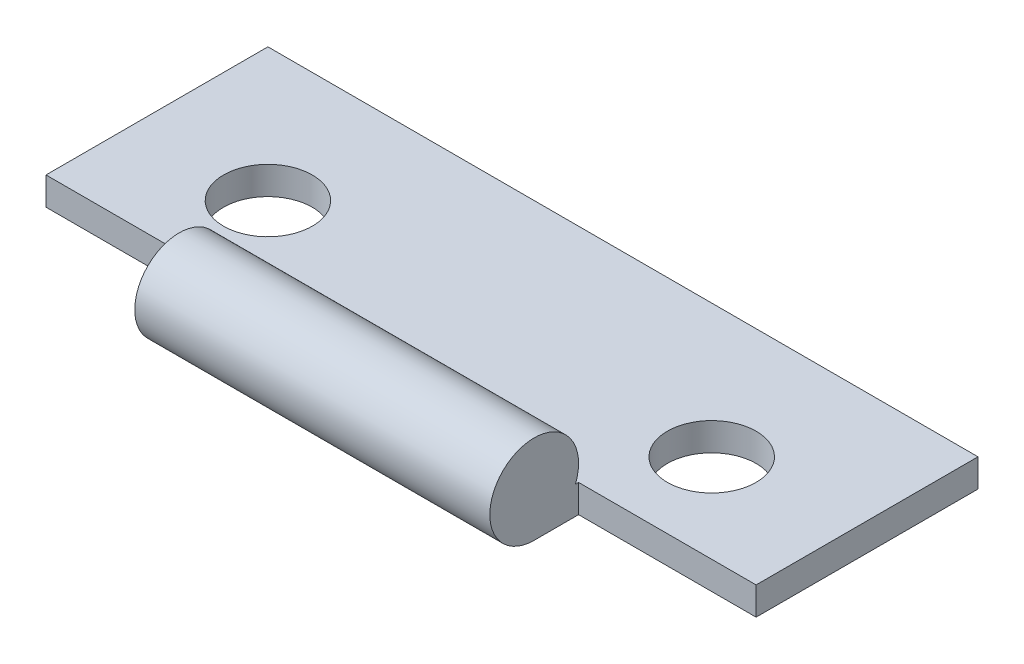
ISO-10303-21;
HEADER;
FILE_DESCRIPTION(('STEP AP214'),'2;1');
FILE_NAME('part.step','',(''),(''),'','','');
FILE_SCHEMA(('AUTOMOTIVE_DESIGN { 1 0 10303 214 1 1 1 1 }'));
ENDSEC;
DATA;
#1=APPLICATION_CONTEXT('core data for automotive mechanical design processes');
#2=APPLICATION_PROTOCOL_DEFINITION('international standard','automotive_design',2000,#1);
#3=PRODUCT_CONTEXT('',#1,'mechanical');
#4=PRODUCT('Part','Part','',(#3));
#5=PRODUCT_RELATED_PRODUCT_CATEGORY('part','',(#4));
#6=PRODUCT_DEFINITION_FORMATION('','',#4);
#7=PRODUCT_DEFINITION_CONTEXT('part definition',#1,'design');
#8=PRODUCT_DEFINITION('design','',#6,#7);
#9=PRODUCT_DEFINITION_SHAPE('','',#8);
#10=(LENGTH_UNIT() NAMED_UNIT(*) SI_UNIT(.MILLI.,.METRE.));
#11=(NAMED_UNIT(*) PLANE_ANGLE_UNIT() SI_UNIT($,.RADIAN.));
#12=(NAMED_UNIT(*) SI_UNIT($,.STERADIAN.) SOLID_ANGLE_UNIT());
#13=UNCERTAINTY_MEASURE_WITH_UNIT(LENGTH_MEASURE(1.E-05),#10,'distance_accuracy_value','');
#14=(GEOMETRIC_REPRESENTATION_CONTEXT(3) GLOBAL_UNCERTAINTY_ASSIGNED_CONTEXT((#13)) GLOBAL_UNIT_ASSIGNED_CONTEXT((#10,
#11,#12)) REPRESENTATION_CONTEXT('',''));
#15=CARTESIAN_POINT('',(0.,0.,0.));
#16=DIRECTION('',(0.,0.,1.));
#17=DIRECTION('',(1.,0.,0.));
#18=AXIS2_PLACEMENT_3D('',#15,#16,#17);
#19=CARTESIAN_POINT('',(-1.19904086659517E-11,1.00000000000033,0.));
#20=DIRECTION('',(0.,1.00000000000007,0.));
#21=DIRECTION('',(0.,0.,1.00000000000007));
#22=AXIS2_PLACEMENT_3D('',#19,#20,#21);
#23=PLANE('',#22);
#24=DIRECTION('',(-1.,0.,0.));
#25=VECTOR('',#24,1.);
#26=CARTESIAN_POINT('',(19.049999999988,1.00000000000033,-1.4747881203814));
#27=LINE('',#26,#25);
#28=CARTESIAN_POINT('',(19.049999999988,1.00000000000033,-1.4747881203814));
#29=VERTEX_POINT('',#28);
#30=CARTESIAN_POINT('',(6.34999999998809,1.00000000000033,-1.4747881203776));
#31=VERTEX_POINT('',#30);
#32=EDGE_CURVE('E53',#29,#31,#27,.T.);
#33=ORIENTED_EDGE('',*,*,#32,.F.);
#34=DIRECTION('',(0.,0.,-1.00000000000007));
#35=VECTOR('',#34,1.);
#36=CARTESIAN_POINT('',(19.049999999988,1.00000000000033,-1.5875000000061));
#37=LINE('',#36,#35);
#38=CARTESIAN_POINT('',(19.049999999988,1.00000000000033,-1.5875000000061));
#39=VERTEX_POINT('',#38);
#40=EDGE_CURVE('E136',#29,#39,#37,.T.);
#41=ORIENTED_EDGE('',*,*,#40,.T.);
#42=DIRECTION('',(1.,0.,0.));
#43=VECTOR('',#42,1.);
#44=CARTESIAN_POINT('',(25.3999999999881,1.00000000000022,-1.58750000000596));
#45=LINE('',#44,#43);
#46=CARTESIAN_POINT('',(25.3999999999881,1.00000000000022,-1.58750000000596));
#47=VERTEX_POINT('',#46);
#48=EDGE_CURVE('E139',#39,#47,#45,.T.);
#49=ORIENTED_EDGE('',*,*,#48,.T.);
#50=DIRECTION('',(0.,0.,-1.00000000000007));
#51=VECTOR('',#50,1.);
#52=CARTESIAN_POINT('',(25.3999999999881,1.00000000000022,-9.52500000000644));
#53=LINE('',#52,#51);
#54=CARTESIAN_POINT('',(25.3999999999881,1.00000000000022,-9.52500000000644));
#55=VERTEX_POINT('',#54);
#56=EDGE_CURVE('E141',#47,#55,#53,.T.);
#57=ORIENTED_EDGE('',*,*,#56,.T.);
#58=DIRECTION('',(-1.,0.,0.));
#59=VECTOR('',#58,1.);
#60=CARTESIAN_POINT('',(-1.19765308781439E-11,1.00000000000033,-9.52500000000001));
#61=LINE('',#60,#59);
#62=CARTESIAN_POINT('',(-1.19765308781439E-11,1.00000000000033,-9.52500000000001));
#63=VERTEX_POINT('',#62);
#64=EDGE_CURVE('E143',#55,#63,#61,.T.);
#65=ORIENTED_EDGE('',*,*,#64,.T.);
#66=DIRECTION('',(0.,0.,1.00000000000007));
#67=VECTOR('',#66,1.);
#68=CARTESIAN_POINT('',(-1.19765308781439E-11,1.00000000000033,-9.52500000000001));
#69=LINE('',#68,#67);
#70=CARTESIAN_POINT('',(-1.19904086659517E-11,1.00000000000033,-1.58749999999996));
#71=VERTEX_POINT('',#70);
#72=EDGE_CURVE('E145',#63,#71,#69,.T.);
#73=ORIENTED_EDGE('',*,*,#72,.T.);
#74=DIRECTION('',(1.,0.,0.));
#75=VECTOR('',#74,1.);
#76=CARTESIAN_POINT('',(-1.19904086659517E-11,1.00000000000033,-1.58749999999996));
#77=LINE('',#76,#75);
#78=CARTESIAN_POINT('',(6.34999999998809,1.00000000000033,-1.5875000000023));
#79=VERTEX_POINT('',#78);
#80=EDGE_CURVE('E147',#71,#79,#77,.T.);
#81=ORIENTED_EDGE('',*,*,#80,.T.);
#82=DIRECTION('',(0.,0.,1.00000000000007));
#83=VECTOR('',#82,1.);
#84=CARTESIAN_POINT('',(6.34999999998809,1.00000000000033,-1.5875000000023));
#85=LINE('',#84,#83);
#86=EDGE_CURVE('E49',#79,#31,#85,.T.);
#87=ORIENTED_EDGE('',*,*,#86,.T.);
#88=EDGE_LOOP('',(#33,#41,#49,#57,#65,#73,#81,#87));
#89=FACE_BOUND('',#88,.T.);
#90=CARTESIAN_POINT('',(4.76249999998801,1.00000000000033,-4.76250000000192));
#91=DIRECTION('',(0.,1.00000000000007,0.));
#92=DIRECTION('',(0.,0.,1.00000000000007));
#93=AXIS2_PLACEMENT_3D('',#90,#91,#92);
#94=CIRCLE('',#93,1.5875);
#95=CARTESIAN_POINT('',(4.76249999998801,1.00000000000033,-3.1750000000018));
#96=VERTEX_POINT('',#95);
#97=EDGE_CURVE('E107',#96,#96,#94,.T.);
#98=ORIENTED_EDGE('',*,*,#97,.F.);
#99=EDGE_LOOP('',(#98));
#100=FACE_BOUND('',#99,.T.);
#101=CARTESIAN_POINT('',(20.6374999999881,1.00000000000033,-4.76250000000655));
#102=DIRECTION('',(0.,1.00000000000007,0.));
#103=DIRECTION('',(0.,0.,-1.00000000000007));
#104=AXIS2_PLACEMENT_3D('',#101,#102,#103);
#105=CIRCLE('',#104,1.5875);
#106=CARTESIAN_POINT('',(20.6374999999881,1.00000000000033,-6.35000000000667));
#107=VERTEX_POINT('',#106);
#108=EDGE_CURVE('E125',#107,#107,#105,.T.);
#109=ORIENTED_EDGE('',*,*,#108,.F.);
#110=EDGE_LOOP('',(#109));
#111=FACE_BOUND('',#110,.T.);
#112=ADVANCED_FACE('F34',(#89,#100,#111),#23,.T.);
#113=CARTESIAN_POINT('',(0.,0.,0.));
#114=DIRECTION('',(0.,1.00000000000007,0.));
#115=DIRECTION('',(0.,0.,1.00000000000007));
#116=AXIS2_PLACEMENT_3D('',#113,#114,#115);
#117=PLANE('',#116);
#118=DIRECTION('',(0.,0.,1.00000000000007));
#119=VECTOR('',#118,1.);
#120=CARTESIAN_POINT('',(6.35000000000008,0.,-1.5875000000023));
#121=LINE('',#120,#119);
#122=CARTESIAN_POINT('',(6.35000000000008,0.,-1.5875000000023));
#123=VERTEX_POINT('',#122);
#124=CARTESIAN_POINT('',(6.35000000000008,0.,-2.33146835171283E-12));
#125=VERTEX_POINT('',#124);
#126=EDGE_CURVE('E98',#123,#125,#121,.T.);
#127=ORIENTED_EDGE('',*,*,#126,.F.);
#128=DIRECTION('',(1.,0.,0.));
#129=VECTOR('',#128,1.);
#130=CARTESIAN_POINT('',(0.,0.,-1.58749999999996));
#131=LINE('',#130,#129);
#132=CARTESIAN_POINT('',(0.,0.,-1.58749999999996));
#133=VERTEX_POINT('',#132);
#134=EDGE_CURVE('E137',#133,#123,#131,.T.);
#135=ORIENTED_EDGE('',*,*,#134,.F.);
#136=DIRECTION('',(0.,0.,1.00000000000007));
#137=VECTOR('',#136,1.);
#138=CARTESIAN_POINT('',(-1.19765308781439E-11,0.,-9.52500000000001));
#139=LINE('',#138,#137);
#140=CARTESIAN_POINT('',(-1.19765308781439E-11,0.,-9.52500000000001));
#141=VERTEX_POINT('',#140);
#142=EDGE_CURVE('E156',#141,#133,#139,.T.);
#143=ORIENTED_EDGE('',*,*,#142,.F.);
#144=DIRECTION('',(-1.,0.,0.));
#145=VECTOR('',#144,1.);
#146=CARTESIAN_POINT('',(-1.19765308781439E-11,0.,-9.52500000000001));
#147=LINE('',#146,#145);
#148=CARTESIAN_POINT('',(25.3999999999881,-1.11022302462516E-13,-9.52500000000644));
#149=VERTEX_POINT('',#148);
#150=EDGE_CURVE('E154',#149,#141,#147,.T.);
#151=ORIENTED_EDGE('',*,*,#150,.F.);
#152=DIRECTION('',(0.,0.,-1.00000000000007));
#153=VECTOR('',#152,1.);
#154=CARTESIAN_POINT('',(25.3999999999881,-1.11022302462516E-13,-9.52500000000644));
#155=LINE('',#154,#153);
#156=CARTESIAN_POINT('',(25.4000000000001,-1.11022302462516E-13,-1.58750000000596));
#157=VERTEX_POINT('',#156);
#158=EDGE_CURVE('E152',#157,#149,#155,.T.);
#159=ORIENTED_EDGE('',*,*,#158,.F.);
#160=DIRECTION('',(1.,0.,0.));
#161=VECTOR('',#160,1.);
#162=CARTESIAN_POINT('',(25.4000000000001,-1.11022302462516E-13,-1.58750000000596));
#163=LINE('',#162,#161);
#164=CARTESIAN_POINT('',(19.05,0.,-1.5875000000061));
#165=VERTEX_POINT('',#164);
#166=EDGE_CURVE('E150',#165,#157,#163,.T.);
#167=ORIENTED_EDGE('',*,*,#166,.F.);
#168=DIRECTION('',(0.,0.,-1.00000000000007));
#169=VECTOR('',#168,1.);
#170=CARTESIAN_POINT('',(19.05,0.,-1.5875000000061));
#171=LINE('',#170,#169);
#172=CARTESIAN_POINT('',(19.05,0.,-6.13398221105399E-12));
#173=VERTEX_POINT('',#172);
#174=EDGE_CURVE('E113',#173,#165,#171,.T.);
#175=ORIENTED_EDGE('',*,*,#174,.F.);
#176=DIRECTION('',(1.,0.,0.));
#177=VECTOR('',#176,1.);
#178=CARTESIAN_POINT('',(6.35000000000008,0.,-2.33146835171283E-12));
#179=LINE('',#178,#177);
#180=EDGE_CURVE('E106',#125,#173,#179,.T.);
#181=ORIENTED_EDGE('',*,*,#180,.F.);
#182=EDGE_LOOP('',(#127,#135,#143,#151,#159,#167,#175,#181));
#183=FACE_BOUND('',#182,.T.);
#184=CARTESIAN_POINT('',(4.7625,0.,-4.76250000000192));
#185=DIRECTION('',(0.,1.00000000000007,0.));
#186=DIRECTION('',(0.,0.,1.00000000000007));
#187=AXIS2_PLACEMENT_3D('',#184,#185,#186);
#188=CIRCLE('',#187,1.5875);
#189=CARTESIAN_POINT('',(4.7625,0.,-3.1750000000018));
#190=VERTEX_POINT('',#189);
#191=EDGE_CURVE('E128',#190,#190,#188,.T.);
#192=ORIENTED_EDGE('',*,*,#191,.T.);
#193=EDGE_LOOP('',(#192));
#194=FACE_BOUND('',#193,.T.);
#195=CARTESIAN_POINT('',(20.6375000000001,0.,-4.76250000000655));
#196=DIRECTION('',(0.,1.00000000000007,0.));
#197=DIRECTION('',(0.,0.,-1.00000000000007));
#198=AXIS2_PLACEMENT_3D('',#195,#196,#197);
#199=CIRCLE('',#198,1.5875);
#200=CARTESIAN_POINT('',(20.6375000000001,0.,-6.35000000000667));
#201=VERTEX_POINT('',#200);
#202=EDGE_CURVE('E124',#201,#201,#199,.T.);
#203=ORIENTED_EDGE('',*,*,#202,.T.);
#204=EDGE_LOOP('',(#203));
#205=FACE_BOUND('',#204,.T.);
#206=ADVANCED_FACE('F110',(#183,#194,#205),#117,.F.);
#207=CARTESIAN_POINT('',(6.34999999998809,1.00000000000033,-1.5875000000023));
#208=DIRECTION('',(1.,0.,0.));
#209=DIRECTION('',(0.,0.,-1.00000000000007));
#210=AXIS2_PLACEMENT_3D('',#207,#208,#209);
#211=PLANE('',#210);
#212=ORIENTED_EDGE('',*,*,#126,.T.);
#213=CARTESIAN_POINT('',(6.34999999998809,1.5875000000003,-2.33146835171283E-12));
#214=DIRECTION('',(-1.,0.,0.));
#215=DIRECTION('',(0.,0.,1.00000000000007));
#216=AXIS2_PLACEMENT_3D('',#213,#214,#215);
#217=CIRCLE('',#216,1.5875);
#218=EDGE_CURVE('E101',#125,#31,#217,.T.);
#219=ORIENTED_EDGE('',*,*,#218,.T.);
#220=ORIENTED_EDGE('',*,*,#86,.F.);
#221=DIRECTION('',(0.,-1.00000000000007,0.));
#222=VECTOR('',#221,1.);
#223=CARTESIAN_POINT('',(6.34999999998809,1.00000000000033,-1.5875000000023));
#224=LINE('',#223,#222);
#225=EDGE_CURVE('E103',#79,#123,#224,.T.);
#226=ORIENTED_EDGE('',*,*,#225,.T.);
#227=EDGE_LOOP('',(#212,#219,#220,#226));
#228=FACE_BOUND('',#227,.T.);
#229=ADVANCED_FACE('F36',(#228),#211,.F.);
#230=CARTESIAN_POINT('',(19.049999999988,1.00000000000033,-1.5875000000061));
#231=DIRECTION('',(-1.,0.,0.));
#232=DIRECTION('',(0.,0.,1.00000000000007));
#233=AXIS2_PLACEMENT_3D('',#230,#231,#232);
#234=PLANE('',#233);
#235=ORIENTED_EDGE('',*,*,#40,.F.);
#236=CARTESIAN_POINT('',(19.049999999988,1.5875000000003,-6.13398221105399E-12));
#237=DIRECTION('',(-1.,0.,0.));
#238=DIRECTION('',(0.,0.,1.00000000000007));
#239=AXIS2_PLACEMENT_3D('',#236,#237,#238);
#240=CIRCLE('',#239,1.5875);
#241=EDGE_CURVE('E119',#173,#29,#240,.T.);
#242=ORIENTED_EDGE('',*,*,#241,.F.);
#243=ORIENTED_EDGE('',*,*,#174,.T.);
#244=DIRECTION('',(0.,-1.00000000000007,0.));
#245=VECTOR('',#244,1.);
#246=CARTESIAN_POINT('',(19.049999999988,1.00000000000033,-1.5875000000061));
#247=LINE('',#246,#245);
#248=EDGE_CURVE('E11',#39,#165,#247,.T.);
#249=ORIENTED_EDGE('',*,*,#248,.F.);
#250=EDGE_LOOP('',(#235,#242,#243,#249));
#251=FACE_BOUND('',#250,.T.);
#252=ADVANCED_FACE('F192',(#251),#234,.F.);
#253=CARTESIAN_POINT('',(25.3999999999881,1.00000000000022,-1.58750000000596));
#254=DIRECTION('',(0.,0.,-1.00000000000007));
#255=DIRECTION('',(-1.,0.,0.));
#256=AXIS2_PLACEMENT_3D('',#253,#254,#255);
#257=PLANE('',#256);
#258=ORIENTED_EDGE('',*,*,#166,.T.);
#259=DIRECTION('',(0.,-1.00000000000007,0.));
#260=VECTOR('',#259,1.);
#261=CARTESIAN_POINT('',(25.3999999999881,1.00000000000022,-1.58750000000596));
#262=LINE('',#261,#260);
#263=EDGE_CURVE('E42',#47,#157,#262,.T.);
#264=ORIENTED_EDGE('',*,*,#263,.F.);
#265=ORIENTED_EDGE('',*,*,#48,.F.);
#266=ORIENTED_EDGE('',*,*,#248,.T.);
#267=EDGE_LOOP('',(#258,#264,#265,#266));
#268=FACE_BOUND('',#267,.T.);
#269=ADVANCED_FACE('F190',(#268),#257,.F.);
#270=CARTESIAN_POINT('',(25.3999999999881,1.00000000000022,-9.52500000000644));
#271=DIRECTION('',(-1.,0.,0.));
#272=DIRECTION('',(0.,0.,1.00000000000007));
#273=AXIS2_PLACEMENT_3D('',#270,#271,#272);
#274=PLANE('',#273);
#275=ORIENTED_EDGE('',*,*,#158,.T.);
#276=DIRECTION('',(0.,-1.00000000000007,0.));
#277=VECTOR('',#276,1.);
#278=CARTESIAN_POINT('',(25.3999999999881,1.00000000000022,-9.52500000000644));
#279=LINE('',#278,#277);
#280=EDGE_CURVE('E166',#55,#149,#279,.T.);
#281=ORIENTED_EDGE('',*,*,#280,.F.);
#282=ORIENTED_EDGE('',*,*,#56,.F.);
#283=ORIENTED_EDGE('',*,*,#263,.T.);
#284=EDGE_LOOP('',(#275,#281,#282,#283));
#285=FACE_BOUND('',#284,.T.);
#286=ADVANCED_FACE('F173',(#285),#274,.F.);
#287=CARTESIAN_POINT('',(-1.19765308781439E-11,1.00000000000033,-9.52500000000001));
#288=DIRECTION('',(0.,0.,1.00000000000007));
#289=DIRECTION('',(1.,0.,0.));
#290=AXIS2_PLACEMENT_3D('',#287,#288,#289);
#291=PLANE('',#290);
#292=ORIENTED_EDGE('',*,*,#150,.T.);
#293=DIRECTION('',(0.,-1.00000000000007,0.));
#294=VECTOR('',#293,1.);
#295=CARTESIAN_POINT('',(-1.19765308781439E-11,1.00000000000033,-9.52500000000001));
#296=LINE('',#295,#294);
#297=EDGE_CURVE('E163',#63,#141,#296,.T.);
#298=ORIENTED_EDGE('',*,*,#297,.F.);
#299=ORIENTED_EDGE('',*,*,#64,.F.);
#300=ORIENTED_EDGE('',*,*,#280,.T.);
#301=EDGE_LOOP('',(#292,#298,#299,#300));
#302=FACE_BOUND('',#301,.T.);
#303=ADVANCED_FACE('F181',(#302),#291,.F.);
#304=CARTESIAN_POINT('',(-1.19765308781439E-11,1.00000000000033,-9.52500000000001));
#305=DIRECTION('',(1.,0.,0.));
#306=DIRECTION('',(0.,0.,-1.00000000000007));
#307=AXIS2_PLACEMENT_3D('',#304,#305,#306);
#308=PLANE('',#307);
#309=ORIENTED_EDGE('',*,*,#142,.T.);
#310=DIRECTION('',(0.,-1.00000000000007,0.));
#311=VECTOR('',#310,1.);
#312=CARTESIAN_POINT('',(-1.19904086659517E-11,1.00000000000033,-1.58749999999996));
#313=LINE('',#312,#311);
#314=EDGE_CURVE('E160',#71,#133,#313,.T.);
#315=ORIENTED_EDGE('',*,*,#314,.F.);
#316=ORIENTED_EDGE('',*,*,#72,.F.);
#317=ORIENTED_EDGE('',*,*,#297,.T.);
#318=EDGE_LOOP('',(#309,#315,#316,#317));
#319=FACE_BOUND('',#318,.T.);
#320=ADVANCED_FACE('F185',(#319),#308,.F.);
#321=CARTESIAN_POINT('',(-1.19904086659517E-11,1.00000000000033,-1.58749999999996));
#322=DIRECTION('',(0.,0.,-1.00000000000007));
#323=DIRECTION('',(-1.,0.,0.));
#324=AXIS2_PLACEMENT_3D('',#321,#322,#323);
#325=PLANE('',#324);
#326=ORIENTED_EDGE('',*,*,#134,.T.);
#327=ORIENTED_EDGE('',*,*,#225,.F.);
#328=ORIENTED_EDGE('',*,*,#80,.F.);
#329=ORIENTED_EDGE('',*,*,#314,.T.);
#330=EDGE_LOOP('',(#326,#327,#328,#329));
#331=FACE_BOUND('',#330,.T.);
#332=ADVANCED_FACE('F209',(#331),#325,.F.);
#333=CARTESIAN_POINT('',(4.76249999998801,1.00000000000033,-4.76250000000192));
#334=DIRECTION('',(0.,-1.00000000000007,0.));
#335=DIRECTION('',(0.,0.,-1.00000000000007));
#336=AXIS2_PLACEMENT_3D('',#333,#334,#335);
#337=CYLINDRICAL_SURFACE('',#336,1.5875);
#338=ORIENTED_EDGE('',*,*,#97,.T.);
#339=EDGE_LOOP('',(#338));
#340=FACE_BOUND('',#339,.T.);
#341=ORIENTED_EDGE('',*,*,#191,.F.);
#342=EDGE_LOOP('',(#341));
#343=FACE_BOUND('',#342,.T.);
#344=ADVANCED_FACE('F206',(#340,#343),#337,.F.);
#345=CARTESIAN_POINT('',(20.6374999999881,1.00000000000033,-4.76250000000655));
#346=DIRECTION('',(0.,-1.00000000000007,0.));
#347=DIRECTION('',(0.,0.,-1.00000000000007));
#348=AXIS2_PLACEMENT_3D('',#345,#346,#347);
#349=CYLINDRICAL_SURFACE('',#348,1.5875);
#350=ORIENTED_EDGE('',*,*,#108,.T.);
#351=EDGE_LOOP('',(#350));
#352=FACE_BOUND('',#351,.T.);
#353=ORIENTED_EDGE('',*,*,#202,.F.);
#354=EDGE_LOOP('',(#353));
#355=FACE_BOUND('',#354,.T.);
#356=ADVANCED_FACE('F240',(#352,#355),#349,.F.);
#357=CARTESIAN_POINT('',(19.049999999988,1.5875000000003,-6.13398221105399E-12));
#358=DIRECTION('',(-1.,0.,0.));
#359=DIRECTION('',(0.,0.,1.00000000000007));
#360=AXIS2_PLACEMENT_3D('',#357,#358,#359);
#361=CYLINDRICAL_SURFACE('',#360,1.5875);
#362=ORIENTED_EDGE('',*,*,#241,.T.);
#363=ORIENTED_EDGE('',*,*,#32,.T.);
#364=ORIENTED_EDGE('',*,*,#218,.F.);
#365=ORIENTED_EDGE('',*,*,#180,.T.);
#366=EDGE_LOOP('',(#362,#363,#364,#365));
#367=FACE_BOUND('',#366,.T.);
#368=ADVANCED_FACE('F118',(#367),#361,.T.);
#369=CLOSED_SHELL('',(#112,#206,#229,#252,#269,#286,#303,#320,#332,#344,#356,#368));
#370=MANIFOLD_SOLID_BREP('B2',#369);
#371=ADVANCED_BREP_SHAPE_REPRESENTATION('',(#18,#370),#14);
#372=SHAPE_DEFINITION_REPRESENTATION(#9,#371);
ENDSEC;
END-ISO-10303-21;
